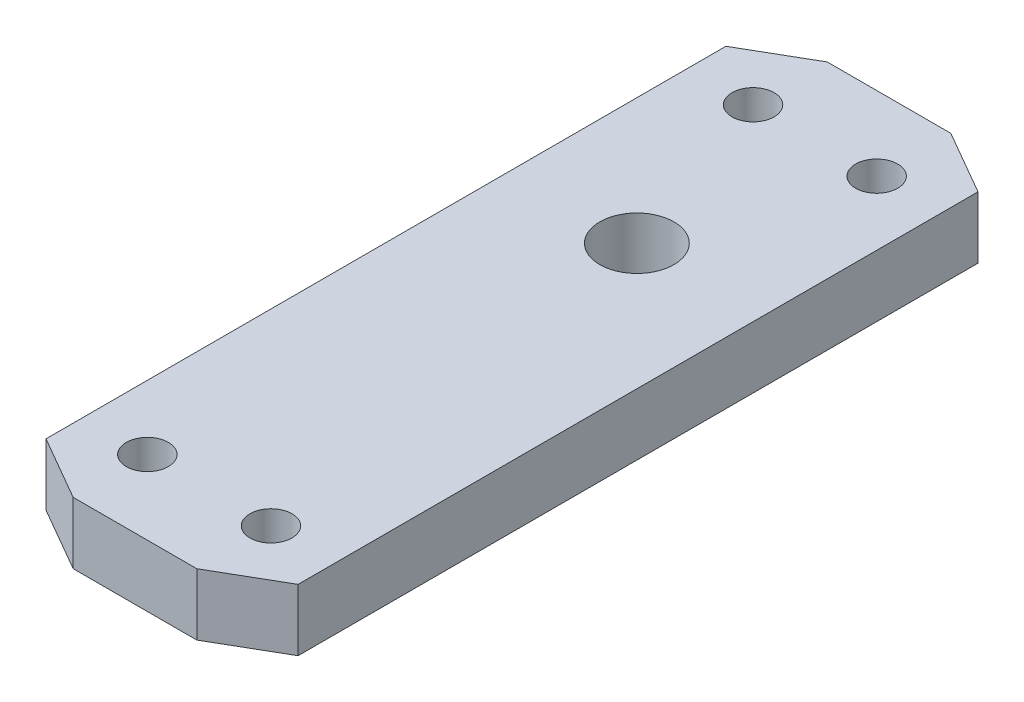
ISO-10303-21;
HEADER;
FILE_DESCRIPTION(('STEP AP214'),'2;1');
FILE_NAME('part.step','',(''),(''),'','','');
FILE_SCHEMA(('AUTOMOTIVE_DESIGN { 1 0 10303 214 1 1 1 1 }'));
ENDSEC;
DATA;
#1=APPLICATION_CONTEXT('core data for automotive mechanical design processes');
#2=APPLICATION_PROTOCOL_DEFINITION('international standard','automotive_design',2000,#1);
#3=PRODUCT_CONTEXT('',#1,'mechanical');
#4=PRODUCT('Part','Part','',(#3));
#5=PRODUCT_RELATED_PRODUCT_CATEGORY('part','',(#4));
#6=PRODUCT_DEFINITION_FORMATION('','',#4);
#7=PRODUCT_DEFINITION_CONTEXT('part definition',#1,'design');
#8=PRODUCT_DEFINITION('design','',#6,#7);
#9=PRODUCT_DEFINITION_SHAPE('','',#8);
#10=(LENGTH_UNIT() NAMED_UNIT(*) SI_UNIT(.MILLI.,.METRE.));
#11=(NAMED_UNIT(*) PLANE_ANGLE_UNIT() SI_UNIT($,.RADIAN.));
#12=(NAMED_UNIT(*) SI_UNIT($,.STERADIAN.) SOLID_ANGLE_UNIT());
#13=UNCERTAINTY_MEASURE_WITH_UNIT(LENGTH_MEASURE(1.E-05),#10,'distance_accuracy_value','');
#14=(GEOMETRIC_REPRESENTATION_CONTEXT(3) GLOBAL_UNCERTAINTY_ASSIGNED_CONTEXT((#13)) GLOBAL_UNIT_ASSIGNED_CONTEXT((#10,
#11,#12)) REPRESENTATION_CONTEXT('',''));
#15=CARTESIAN_POINT('',(0.,0.,0.));
#16=DIRECTION('',(0.,0.,1.));
#17=DIRECTION('',(1.,0.,0.));
#18=AXIS2_PLACEMENT_3D('',#15,#16,#17);
#19=CARTESIAN_POINT('',(0.,5.,0.));
#20=DIRECTION('',(0.,-1.,0.));
#21=DIRECTION('',(0.,0.,-1.));
#22=AXIS2_PLACEMENT_3D('',#19,#20,#21);
#23=PLANE('',#22);
#24=DIRECTION('',(-0.866025403784466,0.,0.499999999999953));
#25=VECTOR('',#24,1.);
#26=CARTESIAN_POINT('',(2725.18938954655,5.,-1307.34972758274));
#27=LINE('',#26,#25);
#28=CARTESIAN_POINT('',(2730.38554196926,5.,-1310.34972758274));
#29=VERTEX_POINT('',#28);
#30=CARTESIAN_POINT('',(2725.18938954655,5.,-1307.34972758274));
#31=VERTEX_POINT('',#30);
#32=EDGE_CURVE('E174',#29,#31,#27,.T.);
#33=ORIENTED_EDGE('',*,*,#32,.T.);
#34=DIRECTION('',(0.,0.,1.));
#35=VECTOR('',#34,1.);
#36=CARTESIAN_POINT('',(2725.18938954655,5.,-1252.34972758274));
#37=LINE('',#36,#35);
#38=CARTESIAN_POINT('',(2725.18938954655,5.,-1252.34972758274));
#39=VERTEX_POINT('',#38);
#40=EDGE_CURVE('E110',#31,#39,#37,.T.);
#41=ORIENTED_EDGE('',*,*,#40,.T.);
#42=DIRECTION('',(0.866025403784466,0.,0.499999999999953));
#43=VECTOR('',#42,1.);
#44=CARTESIAN_POINT('',(2730.38554196926,5.,-1249.34972758274));
#45=LINE('',#44,#43);
#46=CARTESIAN_POINT('',(2730.38554196926,5.,-1249.34972758274));
#47=VERTEX_POINT('',#46);
#48=EDGE_CURVE('E195',#39,#47,#45,.T.);
#49=ORIENTED_EDGE('',*,*,#48,.T.);
#50=DIRECTION('',(1.,0.,0.));
#51=VECTOR('',#50,1.);
#52=CARTESIAN_POINT('',(2740.38554196926,5.,-1249.34972758274));
#53=LINE('',#52,#51);
#54=CARTESIAN_POINT('',(2740.38554196926,5.,-1249.34972758274));
#55=VERTEX_POINT('',#54);
#56=EDGE_CURVE('E209',#47,#55,#53,.T.);
#57=ORIENTED_EDGE('',*,*,#56,.T.);
#58=DIRECTION('',(0.866025403784447,0.,-0.499999999999985));
#59=VECTOR('',#58,1.);
#60=CARTESIAN_POINT('',(2745.58169439196,5.,-1252.34972758274));
#61=LINE('',#60,#59);
#62=CARTESIAN_POINT('',(2745.58169439196,5.,-1252.34972758274));
#63=VERTEX_POINT('',#62);
#64=EDGE_CURVE('E129',#55,#63,#61,.T.);
#65=ORIENTED_EDGE('',*,*,#64,.T.);
#66=DIRECTION('',(0.,0.,-1.));
#67=VECTOR('',#66,1.);
#68=CARTESIAN_POINT('',(2745.58169439196,5.,-1307.34972758274));
#69=LINE('',#68,#67);
#70=CARTESIAN_POINT('',(2745.58169439196,5.,-1307.34972758274));
#71=VERTEX_POINT('',#70);
#72=EDGE_CURVE('E123',#63,#71,#69,.T.);
#73=ORIENTED_EDGE('',*,*,#72,.T.);
#74=DIRECTION('',(-0.866025403784447,0.,-0.499999999999985));
#75=VECTOR('',#74,1.);
#76=CARTESIAN_POINT('',(2740.38554196926,5.,-1310.34972758274));
#77=LINE('',#76,#75);
#78=CARTESIAN_POINT('',(2740.38554196926,5.,-1310.34972758274));
#79=VERTEX_POINT('',#78);
#80=EDGE_CURVE('E127',#71,#79,#77,.T.);
#81=ORIENTED_EDGE('',*,*,#80,.T.);
#82=DIRECTION('',(-1.,0.,0.));
#83=VECTOR('',#82,1.);
#84=CARTESIAN_POINT('',(2730.38554196926,5.,-1310.34972758274));
#85=LINE('',#84,#83);
#86=EDGE_CURVE('E67',#79,#29,#85,.T.);
#87=ORIENTED_EDGE('',*,*,#86,.T.);
#88=EDGE_LOOP('',(#33,#41,#49,#57,#65,#73,#81,#87));
#89=FACE_BOUND('',#88,.T.);
#90=CARTESIAN_POINT('',(2740.38554196926,5.,-1255.34972758274));
#91=DIRECTION('',(0.,1.,0.));
#92=DIRECTION('',(0.,0.,1.));
#93=AXIS2_PLACEMENT_3D('',#90,#91,#92);
#94=CIRCLE('',#93,1.70000000000003);
#95=CARTESIAN_POINT('',(2740.38554196926,5.,-1253.64972758274));
#96=VERTEX_POINT('',#95);
#97=EDGE_CURVE('E156',#96,#96,#94,.T.);
#98=ORIENTED_EDGE('',*,*,#97,.F.);
#99=EDGE_LOOP('',(#98));
#100=FACE_BOUND('',#99,.T.);
#101=CARTESIAN_POINT('',(2730.38554196926,5.,-1255.34972758274));
#102=DIRECTION('',(0.,1.,0.));
#103=DIRECTION('',(0.,0.,1.));
#104=AXIS2_PLACEMENT_3D('',#101,#102,#103);
#105=CIRCLE('',#104,1.70000000000003);
#106=CARTESIAN_POINT('',(2730.38554196926,5.,-1253.64972758274));
#107=VERTEX_POINT('',#106);
#108=EDGE_CURVE('E223',#107,#107,#105,.T.);
#109=ORIENTED_EDGE('',*,*,#108,.F.);
#110=EDGE_LOOP('',(#109));
#111=FACE_BOUND('',#110,.T.);
#112=CARTESIAN_POINT('',(2735.38554196926,5.,-1289.94972758274));
#113=DIRECTION('',(0.,1.,0.));
#114=DIRECTION('',(0.,0.,1.));
#115=AXIS2_PLACEMENT_3D('',#112,#113,#114);
#116=CIRCLE('',#115,3.00000000000011);
#117=CARTESIAN_POINT('',(2735.38554196926,5.,-1286.94972758274));
#118=VERTEX_POINT('',#117);
#119=EDGE_CURVE('E231',#118,#118,#116,.T.);
#120=ORIENTED_EDGE('',*,*,#119,.F.);
#121=EDGE_LOOP('',(#120));
#122=FACE_BOUND('',#121,.T.);
#123=CARTESIAN_POINT('',(2730.38554196926,5.,-1304.34972758274));
#124=DIRECTION('',(0.,1.,0.));
#125=DIRECTION('',(0.,0.,1.));
#126=AXIS2_PLACEMENT_3D('',#123,#124,#125);
#127=CIRCLE('',#126,1.70000000000003);
#128=CARTESIAN_POINT('',(2730.38554196926,5.,-1302.64972758274));
#129=VERTEX_POINT('',#128);
#130=EDGE_CURVE('E239',#129,#129,#127,.T.);
#131=ORIENTED_EDGE('',*,*,#130,.F.);
#132=EDGE_LOOP('',(#131));
#133=FACE_BOUND('',#132,.T.);
#134=CARTESIAN_POINT('',(2740.38554196926,5.,-1304.34972758274));
#135=DIRECTION('',(0.,1.,0.));
#136=DIRECTION('',(0.,0.,1.));
#137=AXIS2_PLACEMENT_3D('',#134,#135,#136);
#138=CIRCLE('',#137,1.70000000000003);
#139=CARTESIAN_POINT('',(2740.38554196926,5.,-1302.64972758274));
#140=VERTEX_POINT('',#139);
#141=EDGE_CURVE('E247',#140,#140,#138,.T.);
#142=ORIENTED_EDGE('',*,*,#141,.F.);
#143=EDGE_LOOP('',(#142));
#144=FACE_BOUND('',#143,.T.);
#145=ADVANCED_FACE('F49',(#89,#100,#111,#122,#133,#144),#23,.F.);
#146=CARTESIAN_POINT('',(0.,0.,0.));
#147=DIRECTION('',(0.,-1.,0.));
#148=DIRECTION('',(0.,0.,-1.));
#149=AXIS2_PLACEMENT_3D('',#146,#147,#148);
#150=PLANE('',#149);
#151=CARTESIAN_POINT('',(2730.38554196926,0.,-1304.34972758274));
#152=DIRECTION('',(0.,1.,0.));
#153=DIRECTION('',(0.,0.,1.));
#154=AXIS2_PLACEMENT_3D('',#151,#152,#153);
#155=CIRCLE('',#154,1.70000000000003);
#156=CARTESIAN_POINT('',(2730.38554196926,0.,-1302.64972758274));
#157=VERTEX_POINT('',#156);
#158=EDGE_CURVE('E243',#157,#157,#155,.T.);
#159=ORIENTED_EDGE('',*,*,#158,.T.);
#160=EDGE_LOOP('',(#159));
#161=FACE_BOUND('',#160,.T.);
#162=CARTESIAN_POINT('',(2730.38554196926,0.,-1255.34972758274));
#163=DIRECTION('',(0.,1.,0.));
#164=DIRECTION('',(0.,0.,1.));
#165=AXIS2_PLACEMENT_3D('',#162,#163,#164);
#166=CIRCLE('',#165,1.70000000000003);
#167=CARTESIAN_POINT('',(2730.38554196926,0.,-1253.64972758274));
#168=VERTEX_POINT('',#167);
#169=EDGE_CURVE('E227',#168,#168,#166,.T.);
#170=ORIENTED_EDGE('',*,*,#169,.T.);
#171=EDGE_LOOP('',(#170));
#172=FACE_BOUND('',#171,.T.);
#173=DIRECTION('',(-0.866025403784466,0.,0.499999999999953));
#174=VECTOR('',#173,1.);
#175=CARTESIAN_POINT('',(2725.18938954655,0.,-1307.34972758274));
#176=LINE('',#175,#174);
#177=CARTESIAN_POINT('',(2730.38554196926,0.,-1310.34972758274));
#178=VERTEX_POINT('',#177);
#179=CARTESIAN_POINT('',(2725.18938954655,0.,-1307.34972758274));
#180=VERTEX_POINT('',#179);
#181=EDGE_CURVE('E151',#178,#180,#176,.T.);
#182=ORIENTED_EDGE('',*,*,#181,.F.);
#183=DIRECTION('',(-1.,0.,0.));
#184=VECTOR('',#183,1.);
#185=CARTESIAN_POINT('',(2730.38554196926,0.,-1310.34972758274));
#186=LINE('',#185,#184);
#187=CARTESIAN_POINT('',(2740.38554196926,0.,-1310.34972758274));
#188=VERTEX_POINT('',#187);
#189=EDGE_CURVE('E102',#188,#178,#186,.T.);
#190=ORIENTED_EDGE('',*,*,#189,.F.);
#191=DIRECTION('',(-0.866025403784447,0.,-0.499999999999985));
#192=VECTOR('',#191,1.);
#193=CARTESIAN_POINT('',(2740.38554196926,0.,-1310.34972758274));
#194=LINE('',#193,#192);
#195=CARTESIAN_POINT('',(2745.58169439196,0.,-1307.34972758274));
#196=VERTEX_POINT('',#195);
#197=EDGE_CURVE('E96',#196,#188,#194,.T.);
#198=ORIENTED_EDGE('',*,*,#197,.F.);
#199=DIRECTION('',(0.,0.,-1.));
#200=VECTOR('',#199,1.);
#201=CARTESIAN_POINT('',(2745.58169439196,0.,-1307.34972758274));
#202=LINE('',#201,#200);
#203=CARTESIAN_POINT('',(2745.58169439196,0.,-1252.34972758274));
#204=VERTEX_POINT('',#203);
#205=EDGE_CURVE('E138',#204,#196,#202,.T.);
#206=ORIENTED_EDGE('',*,*,#205,.F.);
#207=DIRECTION('',(0.866025403784447,0.,-0.499999999999985));
#208=VECTOR('',#207,1.);
#209=CARTESIAN_POINT('',(2745.58169439196,0.,-1252.34972758274));
#210=LINE('',#209,#208);
#211=CARTESIAN_POINT('',(2740.38554196926,0.,-1249.34972758274));
#212=VERTEX_POINT('',#211);
#213=EDGE_CURVE('E165',#212,#204,#210,.T.);
#214=ORIENTED_EDGE('',*,*,#213,.F.);
#215=DIRECTION('',(1.,0.,0.));
#216=VECTOR('',#215,1.);
#217=CARTESIAN_POINT('',(2740.38554196926,0.,-1249.34972758274));
#218=LINE('',#217,#216);
#219=CARTESIAN_POINT('',(2730.38554196926,0.,-1249.34972758274));
#220=VERTEX_POINT('',#219);
#221=EDGE_CURVE('E162',#220,#212,#218,.T.);
#222=ORIENTED_EDGE('',*,*,#221,.F.);
#223=DIRECTION('',(0.866025403784466,0.,0.499999999999953));
#224=VECTOR('',#223,1.);
#225=CARTESIAN_POINT('',(2730.38554196926,0.,-1249.34972758274));
#226=LINE('',#225,#224);
#227=CARTESIAN_POINT('',(2725.18938954655,0.,-1252.34972758274));
#228=VERTEX_POINT('',#227);
#229=EDGE_CURVE('E159',#228,#220,#226,.T.);
#230=ORIENTED_EDGE('',*,*,#229,.F.);
#231=DIRECTION('',(0.,0.,1.));
#232=VECTOR('',#231,1.);
#233=CARTESIAN_POINT('',(2725.18938954655,0.,-1252.34972758274));
#234=LINE('',#233,#232);
#235=EDGE_CURVE('E155',#180,#228,#234,.T.);
#236=ORIENTED_EDGE('',*,*,#235,.F.);
#237=EDGE_LOOP('',(#182,#190,#198,#206,#214,#222,#230,#236));
#238=FACE_BOUND('',#237,.T.);
#239=CARTESIAN_POINT('',(2740.38554196926,0.,-1255.34972758274));
#240=DIRECTION('',(0.,1.,0.));
#241=DIRECTION('',(0.,0.,1.));
#242=AXIS2_PLACEMENT_3D('',#239,#240,#241);
#243=CIRCLE('',#242,1.70000000000003);
#244=CARTESIAN_POINT('',(2740.38554196926,0.,-1253.64972758274));
#245=VERTEX_POINT('',#244);
#246=EDGE_CURVE('E219',#245,#245,#243,.T.);
#247=ORIENTED_EDGE('',*,*,#246,.T.);
#248=EDGE_LOOP('',(#247));
#249=FACE_BOUND('',#248,.T.);
#250=CARTESIAN_POINT('',(2735.38554196926,0.,-1289.94972758274));
#251=DIRECTION('',(0.,1.,0.));
#252=DIRECTION('',(0.,0.,1.));
#253=AXIS2_PLACEMENT_3D('',#250,#251,#252);
#254=CIRCLE('',#253,3.00000000000011);
#255=CARTESIAN_POINT('',(2735.38554196926,0.,-1286.94972758274));
#256=VERTEX_POINT('',#255);
#257=EDGE_CURVE('E235',#256,#256,#254,.T.);
#258=ORIENTED_EDGE('',*,*,#257,.T.);
#259=EDGE_LOOP('',(#258));
#260=FACE_BOUND('',#259,.T.);
#261=CARTESIAN_POINT('',(2740.38554196926,0.,-1304.34972758274));
#262=DIRECTION('',(0.,1.,0.));
#263=DIRECTION('',(0.,0.,1.));
#264=AXIS2_PLACEMENT_3D('',#261,#262,#263);
#265=CIRCLE('',#264,1.70000000000003);
#266=CARTESIAN_POINT('',(2740.38554196926,0.,-1302.64972758274));
#267=VERTEX_POINT('',#266);
#268=EDGE_CURVE('E251',#267,#267,#265,.T.);
#269=ORIENTED_EDGE('',*,*,#268,.T.);
#270=EDGE_LOOP('',(#269));
#271=FACE_BOUND('',#270,.T.);
#272=ADVANCED_FACE('F199',(#161,#172,#238,#249,#260,#271),#150,.T.);
#273=CARTESIAN_POINT('',(2725.18938954655,5.,-1307.34972758274));
#274=DIRECTION('',(0.499999999999953,0.,0.866025403784466));
#275=DIRECTION('',(0.866025403784466,0.,-0.499999999999953));
#276=AXIS2_PLACEMENT_3D('',#273,#274,#275);
#277=PLANE('',#276);
#278=ORIENTED_EDGE('',*,*,#181,.T.);
#279=DIRECTION('',(0.,-1.,0.));
#280=VECTOR('',#279,1.);
#281=CARTESIAN_POINT('',(2725.18938954655,5.,-1307.34972758274));
#282=LINE('',#281,#280);
#283=EDGE_CURVE('E11',#31,#180,#282,.T.);
#284=ORIENTED_EDGE('',*,*,#283,.F.);
#285=ORIENTED_EDGE('',*,*,#32,.F.);
#286=DIRECTION('',(0.,-1.,0.));
#287=VECTOR('',#286,1.);
#288=CARTESIAN_POINT('',(2730.38554196926,5.,-1310.34972758274));
#289=LINE('',#288,#287);
#290=EDGE_CURVE('E147',#29,#178,#289,.T.);
#291=ORIENTED_EDGE('',*,*,#290,.T.);
#292=EDGE_LOOP('',(#278,#284,#285,#291));
#293=FACE_BOUND('',#292,.T.);
#294=ADVANCED_FACE('F51',(#293),#277,.F.);
#295=CARTESIAN_POINT('',(2725.18938954655,5.,-1252.34972758274));
#296=DIRECTION('',(1.,0.,0.));
#297=DIRECTION('',(0.,0.,-1.));
#298=AXIS2_PLACEMENT_3D('',#295,#296,#297);
#299=PLANE('',#298);
#300=ORIENTED_EDGE('',*,*,#235,.T.);
#301=DIRECTION('',(0.,-1.,0.));
#302=VECTOR('',#301,1.);
#303=CARTESIAN_POINT('',(2725.18938954655,5.,-1252.34972758274));
#304=LINE('',#303,#302);
#305=EDGE_CURVE('E59',#39,#228,#304,.T.);
#306=ORIENTED_EDGE('',*,*,#305,.F.);
#307=ORIENTED_EDGE('',*,*,#40,.F.);
#308=ORIENTED_EDGE('',*,*,#283,.T.);
#309=EDGE_LOOP('',(#300,#306,#307,#308));
#310=FACE_BOUND('',#309,.T.);
#311=ADVANCED_FACE('F285',(#310),#299,.F.);
#312=CARTESIAN_POINT('',(2730.38554196926,5.,-1249.34972758274));
#313=DIRECTION('',(0.499999999999953,0.,-0.866025403784466));
#314=DIRECTION('',(-0.866025403784466,0.,-0.499999999999953));
#315=AXIS2_PLACEMENT_3D('',#312,#313,#314);
#316=PLANE('',#315);
#317=ORIENTED_EDGE('',*,*,#229,.T.);
#318=DIRECTION('',(0.,-1.,0.));
#319=VECTOR('',#318,1.);
#320=CARTESIAN_POINT('',(2730.38554196926,5.,-1249.34972758274));
#321=LINE('',#320,#319);
#322=EDGE_CURVE('E185',#47,#220,#321,.T.);
#323=ORIENTED_EDGE('',*,*,#322,.F.);
#324=ORIENTED_EDGE('',*,*,#48,.F.);
#325=ORIENTED_EDGE('',*,*,#305,.T.);
#326=EDGE_LOOP('',(#317,#323,#324,#325));
#327=FACE_BOUND('',#326,.T.);
#328=ADVANCED_FACE('F193',(#327),#316,.F.);
#329=CARTESIAN_POINT('',(2740.38554196926,5.,-1249.34972758274));
#330=DIRECTION('',(0.,0.,-1.));
#331=DIRECTION('',(-1.,0.,0.));
#332=AXIS2_PLACEMENT_3D('',#329,#330,#331);
#333=PLANE('',#332);
#334=ORIENTED_EDGE('',*,*,#221,.T.);
#335=DIRECTION('',(0.,-1.,0.));
#336=VECTOR('',#335,1.);
#337=CARTESIAN_POINT('',(2740.38554196926,5.,-1249.34972758274));
#338=LINE('',#337,#336);
#339=EDGE_CURVE('E181',#55,#212,#338,.T.);
#340=ORIENTED_EDGE('',*,*,#339,.F.);
#341=ORIENTED_EDGE('',*,*,#56,.F.);
#342=ORIENTED_EDGE('',*,*,#322,.T.);
#343=EDGE_LOOP('',(#334,#340,#341,#342));
#344=FACE_BOUND('',#343,.T.);
#345=ADVANCED_FACE('F204',(#344),#333,.F.);
#346=CARTESIAN_POINT('',(2745.58169439196,5.,-1252.34972758274));
#347=DIRECTION('',(-0.499999999999985,0.,-0.866025403784447));
#348=DIRECTION('',(-0.866025403784447,0.,0.499999999999985));
#349=AXIS2_PLACEMENT_3D('',#346,#347,#348);
#350=PLANE('',#349);
#351=ORIENTED_EDGE('',*,*,#213,.T.);
#352=DIRECTION('',(0.,-1.,0.));
#353=VECTOR('',#352,1.);
#354=CARTESIAN_POINT('',(2745.58169439196,5.,-1252.34972758274));
#355=LINE('',#354,#353);
#356=EDGE_CURVE('E140',#63,#204,#355,.T.);
#357=ORIENTED_EDGE('',*,*,#356,.F.);
#358=ORIENTED_EDGE('',*,*,#64,.F.);
#359=ORIENTED_EDGE('',*,*,#339,.T.);
#360=EDGE_LOOP('',(#351,#357,#358,#359));
#361=FACE_BOUND('',#360,.T.);
#362=ADVANCED_FACE('F207',(#361),#350,.F.);
#363=CARTESIAN_POINT('',(2745.58169439196,5.,-1307.34972758274));
#364=DIRECTION('',(-1.,0.,0.));
#365=DIRECTION('',(0.,0.,1.));
#366=AXIS2_PLACEMENT_3D('',#363,#364,#365);
#367=PLANE('',#366);
#368=ORIENTED_EDGE('',*,*,#205,.T.);
#369=DIRECTION('',(0.,-1.,0.));
#370=VECTOR('',#369,1.);
#371=CARTESIAN_POINT('',(2745.58169439196,5.,-1307.34972758274));
#372=LINE('',#371,#370);
#373=EDGE_CURVE('E135',#71,#196,#372,.T.);
#374=ORIENTED_EDGE('',*,*,#373,.F.);
#375=ORIENTED_EDGE('',*,*,#72,.F.);
#376=ORIENTED_EDGE('',*,*,#356,.T.);
#377=EDGE_LOOP('',(#368,#374,#375,#376));
#378=FACE_BOUND('',#377,.T.);
#379=ADVANCED_FACE('F136',(#378),#367,.F.);
#380=CARTESIAN_POINT('',(2740.38554196926,5.,-1310.34972758274));
#381=DIRECTION('',(-0.499999999999985,0.,0.866025403784447));
#382=DIRECTION('',(0.866025403784447,0.,0.499999999999985));
#383=AXIS2_PLACEMENT_3D('',#380,#381,#382);
#384=PLANE('',#383);
#385=ORIENTED_EDGE('',*,*,#197,.T.);
#386=DIRECTION('',(0.,-1.,0.));
#387=VECTOR('',#386,1.);
#388=CARTESIAN_POINT('',(2740.38554196926,5.,-1310.34972758274));
#389=LINE('',#388,#387);
#390=EDGE_CURVE('E141',#79,#188,#389,.T.);
#391=ORIENTED_EDGE('',*,*,#390,.F.);
#392=ORIENTED_EDGE('',*,*,#80,.F.);
#393=ORIENTED_EDGE('',*,*,#373,.T.);
#394=EDGE_LOOP('',(#385,#391,#392,#393));
#395=FACE_BOUND('',#394,.T.);
#396=ADVANCED_FACE('F143',(#395),#384,.F.);
#397=CARTESIAN_POINT('',(2730.38554196926,5.,-1310.34972758274));
#398=DIRECTION('',(0.,0.,1.));
#399=DIRECTION('',(1.,0.,0.));
#400=AXIS2_PLACEMENT_3D('',#397,#398,#399);
#401=PLANE('',#400);
#402=ORIENTED_EDGE('',*,*,#189,.T.);
#403=ORIENTED_EDGE('',*,*,#290,.F.);
#404=ORIENTED_EDGE('',*,*,#86,.F.);
#405=ORIENTED_EDGE('',*,*,#390,.T.);
#406=EDGE_LOOP('',(#402,#403,#404,#405));
#407=FACE_BOUND('',#406,.T.);
#408=ADVANCED_FACE('F273',(#407),#401,.F.);
#409=CARTESIAN_POINT('',(2740.38554196926,5.,-1255.34972758274));
#410=DIRECTION('',(0.,-1.,0.));
#411=DIRECTION('',(0.,0.,-1.));
#412=AXIS2_PLACEMENT_3D('',#409,#410,#411);
#413=CYLINDRICAL_SURFACE('',#412,1.70000000000003);
#414=ORIENTED_EDGE('',*,*,#97,.T.);
#415=EDGE_LOOP('',(#414));
#416=FACE_BOUND('',#415,.T.);
#417=ORIENTED_EDGE('',*,*,#246,.F.);
#418=EDGE_LOOP('',(#417));
#419=FACE_BOUND('',#418,.T.);
#420=ADVANCED_FACE('F270',(#416,#419),#413,.F.);
#421=CARTESIAN_POINT('',(2730.38554196926,5.,-1255.34972758274));
#422=DIRECTION('',(0.,-1.,0.));
#423=DIRECTION('',(0.,0.,-1.));
#424=AXIS2_PLACEMENT_3D('',#421,#422,#423);
#425=CYLINDRICAL_SURFACE('',#424,1.70000000000003);
#426=ORIENTED_EDGE('',*,*,#108,.T.);
#427=EDGE_LOOP('',(#426));
#428=FACE_BOUND('',#427,.T.);
#429=ORIENTED_EDGE('',*,*,#169,.F.);
#430=EDGE_LOOP('',(#429));
#431=FACE_BOUND('',#430,.T.);
#432=ADVANCED_FACE('F383',(#428,#431),#425,.F.);
#433=CARTESIAN_POINT('',(2735.38554196926,5.,-1289.94972758274));
#434=DIRECTION('',(0.,-1.,0.));
#435=DIRECTION('',(0.,0.,-1.));
#436=AXIS2_PLACEMENT_3D('',#433,#434,#435);
#437=CYLINDRICAL_SURFACE('',#436,3.00000000000011);
#438=ORIENTED_EDGE('',*,*,#119,.T.);
#439=EDGE_LOOP('',(#438));
#440=FACE_BOUND('',#439,.T.);
#441=ORIENTED_EDGE('',*,*,#257,.F.);
#442=EDGE_LOOP('',(#441));
#443=FACE_BOUND('',#442,.T.);
#444=ADVANCED_FACE('F394',(#440,#443),#437,.F.);
#445=CARTESIAN_POINT('',(2730.38554196926,5.,-1304.34972758274));
#446=DIRECTION('',(0.,-1.,0.));
#447=DIRECTION('',(0.,0.,-1.));
#448=AXIS2_PLACEMENT_3D('',#445,#446,#447);
#449=CYLINDRICAL_SURFACE('',#448,1.70000000000003);
#450=ORIENTED_EDGE('',*,*,#130,.T.);
#451=EDGE_LOOP('',(#450));
#452=FACE_BOUND('',#451,.T.);
#453=ORIENTED_EDGE('',*,*,#158,.F.);
#454=EDGE_LOOP('',(#453));
#455=FACE_BOUND('',#454,.T.);
#456=ADVANCED_FACE('F405',(#452,#455),#449,.F.);
#457=CARTESIAN_POINT('',(2740.38554196926,5.,-1304.34972758274));
#458=DIRECTION('',(0.,-1.,0.));
#459=DIRECTION('',(0.,0.,-1.));
#460=AXIS2_PLACEMENT_3D('',#457,#458,#459);
#461=CYLINDRICAL_SURFACE('',#460,1.70000000000003);
#462=ORIENTED_EDGE('',*,*,#141,.T.);
#463=EDGE_LOOP('',(#462));
#464=FACE_BOUND('',#463,.T.);
#465=ORIENTED_EDGE('',*,*,#268,.F.);
#466=EDGE_LOOP('',(#465));
#467=FACE_BOUND('',#466,.T.);
#468=ADVANCED_FACE('F259',(#464,#467),#461,.F.);
#469=CLOSED_SHELL('',(#145,#272,#294,#311,#328,#345,#362,#379,#396,#408,#420,#432,#444,#456,#468));
#470=MANIFOLD_SOLID_BREP('B2',#469);
#471=ADVANCED_BREP_SHAPE_REPRESENTATION('',(#18,#470),#14);
#472=SHAPE_DEFINITION_REPRESENTATION(#9,#471);
ENDSEC;
END-ISO-10303-21;
